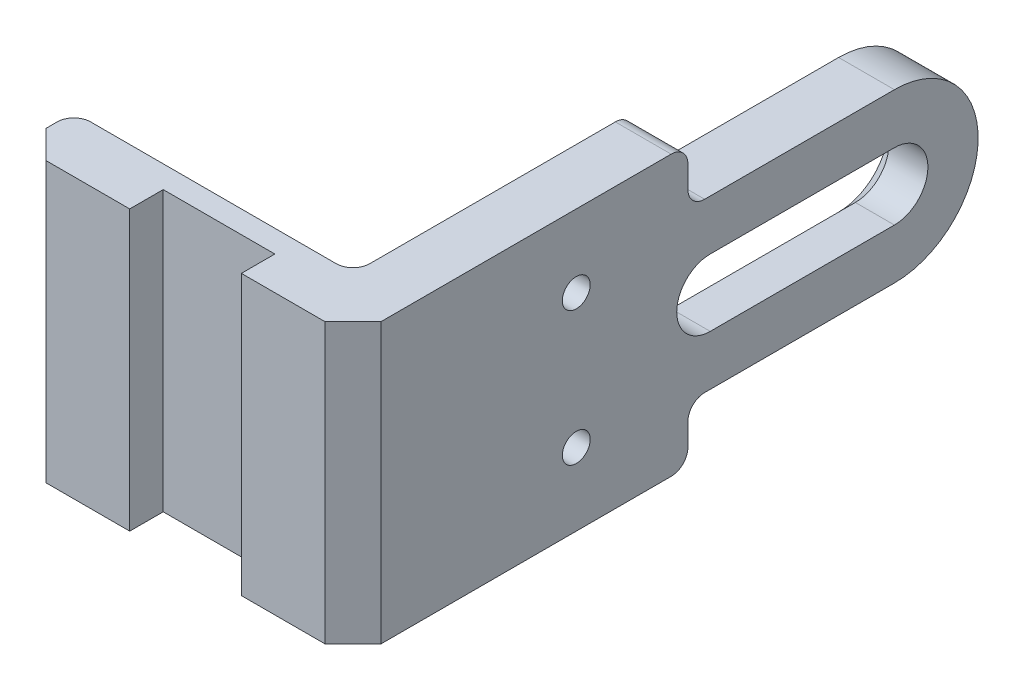
ISO-10303-21;
HEADER;
FILE_DESCRIPTION(('STEP AP214'),'2;1');
FILE_NAME('part.step','',(''),(''),'','','');
FILE_SCHEMA(('AUTOMOTIVE_DESIGN { 1 0 10303 214 1 1 1 1 }'));
ENDSEC;
DATA;
#1=APPLICATION_CONTEXT('core data for automotive mechanical design processes');
#2=APPLICATION_PROTOCOL_DEFINITION('international standard','automotive_design',2000,#1);
#3=PRODUCT_CONTEXT('',#1,'mechanical');
#4=PRODUCT('Part','Part','',(#3));
#5=PRODUCT_RELATED_PRODUCT_CATEGORY('part','',(#4));
#6=PRODUCT_DEFINITION_FORMATION('','',#4);
#7=PRODUCT_DEFINITION_CONTEXT('part definition',#1,'design');
#8=PRODUCT_DEFINITION('design','',#6,#7);
#9=PRODUCT_DEFINITION_SHAPE('','',#8);
#10=(LENGTH_UNIT() NAMED_UNIT(*) SI_UNIT(.MILLI.,.METRE.));
#11=(NAMED_UNIT(*) PLANE_ANGLE_UNIT() SI_UNIT($,.RADIAN.));
#12=(NAMED_UNIT(*) SI_UNIT($,.STERADIAN.) SOLID_ANGLE_UNIT());
#13=UNCERTAINTY_MEASURE_WITH_UNIT(LENGTH_MEASURE(1.E-05),#10,'distance_accuracy_value','');
#14=(GEOMETRIC_REPRESENTATION_CONTEXT(3) GLOBAL_UNCERTAINTY_ASSIGNED_CONTEXT((#13)) GLOBAL_UNIT_ASSIGNED_CONTEXT((#10,
#11,#12)) REPRESENTATION_CONTEXT('',''));
#15=CARTESIAN_POINT('',(0.,0.,0.));
#16=DIRECTION('',(0.,0.,1.));
#17=DIRECTION('',(1.,0.,0.));
#18=AXIS2_PLACEMENT_3D('',#15,#16,#17);
#19=CARTESIAN_POINT('',(0.,25.,0.));
#20=DIRECTION('',(0.,0.,1.));
#21=DIRECTION('',(1.,0.,0.));
#22=AXIS2_PLACEMENT_3D('',#19,#20,#21);
#23=PLANE('',#22);
#24=DIRECTION('',(-1.,0.,0.));
#25=VECTOR('',#24,1.);
#26=CARTESIAN_POINT('',(0.,0.,0.));
#27=LINE('',#26,#25);
#28=CARTESIAN_POINT('',(-2.50000000000002,0.,0.));
#29=VERTEX_POINT('',#28);
#30=CARTESIAN_POINT('',(-10.,0.,0.));
#31=VERTEX_POINT('',#30);
#32=EDGE_CURVE('E249',#29,#31,#27,.T.);
#33=ORIENTED_EDGE('',*,*,#32,.F.);
#34=DIRECTION('',(0.,1.,0.));
#35=VECTOR('',#34,1.);
#36=CARTESIAN_POINT('',(-2.50000000000002,25.,0.));
#37=LINE('',#36,#35);
#38=CARTESIAN_POINT('',(-2.50000000000002,25.,0.));
#39=VERTEX_POINT('',#38);
#40=EDGE_CURVE('E409',#29,#39,#37,.T.);
#41=ORIENTED_EDGE('',*,*,#40,.T.);
#42=DIRECTION('',(-1.,0.,0.));
#43=VECTOR('',#42,1.);
#44=CARTESIAN_POINT('',(0.,25.,0.));
#45=LINE('',#44,#43);
#46=CARTESIAN_POINT('',(-10.,25.,0.));
#47=VERTEX_POINT('',#46);
#48=EDGE_CURVE('E332',#39,#47,#45,.T.);
#49=ORIENTED_EDGE('',*,*,#48,.T.);
#50=DIRECTION('',(0.,1.,0.));
#51=VECTOR('',#50,1.);
#52=CARTESIAN_POINT('',(-10.,0.,0.));
#53=LINE('',#52,#51);
#54=EDGE_CURVE('E244',#31,#47,#53,.T.);
#55=ORIENTED_EDGE('',*,*,#54,.F.);
#56=EDGE_LOOP('',(#33,#41,#49,#55));
#57=FACE_BOUND('',#56,.T.);
#58=ADVANCED_FACE('F37',(#57),#23,.T.);
#59=CARTESIAN_POINT('',(0.,25.,0.));
#60=DIRECTION('',(0.,-1.,0.));
#61=DIRECTION('',(0.,0.,-1.));
#62=AXIS2_PLACEMENT_3D('',#59,#60,#61);
#63=PLANE('',#62);
#64=DIRECTION('',(-1.,0.,0.));
#65=VECTOR('',#64,1.);
#66=CARTESIAN_POINT('',(-5.,25.,-5.));
#67=LINE('',#66,#65);
#68=CARTESIAN_POINT('',(-6.5,25.,-5.));
#69=VERTEX_POINT('',#68);
#70=CARTESIAN_POINT('',(-28.5,25.,-5.));
#71=VERTEX_POINT('',#70);
#72=EDGE_CURVE('E338',#69,#71,#67,.T.);
#73=ORIENTED_EDGE('',*,*,#72,.T.);
#74=CARTESIAN_POINT('',(-28.5,25.,-3.5));
#75=DIRECTION('',(0.,-1.,0.));
#76=DIRECTION('',(0.,0.,-1.));
#77=AXIS2_PLACEMENT_3D('',#74,#75,#76);
#78=CIRCLE('',#77,1.5);
#79=CARTESIAN_POINT('',(-30.,25.,-3.5));
#80=VERTEX_POINT('',#79);
#81=EDGE_CURVE('E430',#71,#80,#78,.F.);
#82=ORIENTED_EDGE('',*,*,#81,.T.);
#83=DIRECTION('',(0.,0.,-1.));
#84=VECTOR('',#83,1.);
#85=CARTESIAN_POINT('',(-30.,25.,0.));
#86=LINE('',#85,#84);
#87=CARTESIAN_POINT('',(-30.,25.,-2.50000000000001));
#88=VERTEX_POINT('',#87);
#89=EDGE_CURVE('E334',#88,#80,#86,.T.);
#90=ORIENTED_EDGE('',*,*,#89,.F.);
#91=DIRECTION('',(-0.707106781186546,0.,-0.707106781186549));
#92=VECTOR('',#91,1.);
#93=CARTESIAN_POINT('',(-27.5,25.,0.));
#94=LINE('',#93,#92);
#95=CARTESIAN_POINT('',(-27.5,25.,0.));
#96=VERTEX_POINT('',#95);
#97=EDGE_CURVE('E411',#88,#96,#94,.F.);
#98=ORIENTED_EDGE('',*,*,#97,.T.);
#99=CARTESIAN_POINT('',(-20.,25.,0.));
#100=VERTEX_POINT('',#99);
#101=EDGE_CURVE('E335',#100,#96,#45,.T.);
#102=ORIENTED_EDGE('',*,*,#101,.F.);
#103=DIRECTION('',(0.,0.,1.));
#104=VECTOR('',#103,1.);
#105=CARTESIAN_POINT('',(-20.,25.,-3.));
#106=LINE('',#105,#104);
#107=CARTESIAN_POINT('',(-20.,25.,-3.));
#108=VERTEX_POINT('',#107);
#109=EDGE_CURVE('E234',#108,#100,#106,.T.);
#110=ORIENTED_EDGE('',*,*,#109,.F.);
#111=DIRECTION('',(1.,0.,0.));
#112=VECTOR('',#111,1.);
#113=CARTESIAN_POINT('',(-20.,25.,-3.));
#114=LINE('',#113,#112);
#115=CARTESIAN_POINT('',(-10.,25.,-3.));
#116=VERTEX_POINT('',#115);
#117=EDGE_CURVE('E254',#108,#116,#114,.T.);
#118=ORIENTED_EDGE('',*,*,#117,.T.);
#119=DIRECTION('',(0.,0.,1.));
#120=VECTOR('',#119,1.);
#121=CARTESIAN_POINT('',(-10.,25.,-3.));
#122=LINE('',#121,#120);
#123=EDGE_CURVE('E242',#116,#47,#122,.T.);
#124=ORIENTED_EDGE('',*,*,#123,.T.);
#125=ORIENTED_EDGE('',*,*,#48,.F.);
#126=DIRECTION('',(0.707106781186549,0.,-0.707106781186546));
#127=VECTOR('',#126,1.);
#128=CARTESIAN_POINT('',(0.,25.,-2.50000000000001));
#129=LINE('',#128,#127);
#130=CARTESIAN_POINT('',(0.,25.,-2.50000000000001));
#131=VERTEX_POINT('',#130);
#132=EDGE_CURVE('E413',#39,#131,#129,.T.);
#133=ORIENTED_EDGE('',*,*,#132,.T.);
#134=DIRECTION('',(0.,0.,-1.));
#135=VECTOR('',#134,1.);
#136=CARTESIAN_POINT('',(0.,25.,0.));
#137=LINE('',#136,#135);
#138=CARTESIAN_POINT('',(0.,25.,-28.5));
#139=VERTEX_POINT('',#138);
#140=EDGE_CURVE('E343',#131,#139,#137,.T.);
#141=ORIENTED_EDGE('',*,*,#140,.T.);
#142=DIRECTION('',(-1.,0.,0.));
#143=VECTOR('',#142,1.);
#144=CARTESIAN_POINT('',(0.,25.,-28.5));
#145=LINE('',#144,#143);
#146=CARTESIAN_POINT('',(-5.,25.,-28.5));
#147=VERTEX_POINT('',#146);
#148=EDGE_CURVE('E391',#139,#147,#145,.T.);
#149=ORIENTED_EDGE('',*,*,#148,.T.);
#150=DIRECTION('',(0.,0.,-1.));
#151=VECTOR('',#150,1.);
#152=CARTESIAN_POINT('',(-5.,25.,-5.));
#153=LINE('',#152,#151);
#154=CARTESIAN_POINT('',(-5.,25.,-6.5));
#155=VERTEX_POINT('',#154);
#156=EDGE_CURVE('E341',#155,#147,#153,.T.);
#157=ORIENTED_EDGE('',*,*,#156,.F.);
#158=CARTESIAN_POINT('',(-6.5,25.,-6.5));
#159=DIRECTION('',(0.,-1.,0.));
#160=DIRECTION('',(0.,0.,-1.));
#161=AXIS2_PLACEMENT_3D('',#158,#159,#160);
#162=CIRCLE('',#161,1.5);
#163=EDGE_CURVE('E436',#155,#69,#162,.T.);
#164=ORIENTED_EDGE('',*,*,#163,.T.);
#165=EDGE_LOOP('',(#73,#82,#90,#98,#102,#110,#118,#124,#125,#133,#141,#149,#157,#164));
#166=FACE_BOUND('',#165,.T.);
#167=ADVANCED_FACE('F504',(#166),#63,.F.);
#168=CARTESIAN_POINT('',(0.,0.,0.));
#169=DIRECTION('',(0.,-1.,0.));
#170=DIRECTION('',(0.,0.,-1.));
#171=AXIS2_PLACEMENT_3D('',#168,#169,#170);
#172=PLANE('',#171);
#173=DIRECTION('',(0.,0.,-1.));
#174=VECTOR('',#173,1.);
#175=CARTESIAN_POINT('',(-30.,0.,0.));
#176=LINE('',#175,#174);
#177=CARTESIAN_POINT('',(-30.,0.,-2.50000000000001));
#178=VERTEX_POINT('',#177);
#179=CARTESIAN_POINT('',(-30.,0.,-3.5));
#180=VERTEX_POINT('',#179);
#181=EDGE_CURVE('E347',#178,#180,#176,.T.);
#182=ORIENTED_EDGE('',*,*,#181,.T.);
#183=CARTESIAN_POINT('',(-28.5,0.,-3.5));
#184=DIRECTION('',(0.,-1.,0.));
#185=DIRECTION('',(0.,0.,-1.));
#186=AXIS2_PLACEMENT_3D('',#183,#184,#185);
#187=CIRCLE('',#186,1.5);
#188=CARTESIAN_POINT('',(-28.5,0.,-5.));
#189=VERTEX_POINT('',#188);
#190=EDGE_CURVE('E423',#180,#189,#187,.T.);
#191=ORIENTED_EDGE('',*,*,#190,.T.);
#192=DIRECTION('',(-1.,0.,0.));
#193=VECTOR('',#192,1.);
#194=CARTESIAN_POINT('',(-5.,0.,-5.));
#195=LINE('',#194,#193);
#196=CARTESIAN_POINT('',(-6.5,0.,-5.));
#197=VERTEX_POINT('',#196);
#198=EDGE_CURVE('E349',#197,#189,#195,.T.);
#199=ORIENTED_EDGE('',*,*,#198,.F.);
#200=CARTESIAN_POINT('',(-6.5,0.,-6.5));
#201=DIRECTION('',(0.,-1.,0.));
#202=DIRECTION('',(0.,0.,-1.));
#203=AXIS2_PLACEMENT_3D('',#200,#201,#202);
#204=CIRCLE('',#203,1.5);
#205=CARTESIAN_POINT('',(-5.,0.,-6.5));
#206=VERTEX_POINT('',#205);
#207=EDGE_CURVE('E434',#197,#206,#204,.F.);
#208=ORIENTED_EDGE('',*,*,#207,.T.);
#209=DIRECTION('',(0.,0.,-1.));
#210=VECTOR('',#209,1.);
#211=CARTESIAN_POINT('',(-5.,0.,-5.));
#212=LINE('',#211,#210);
#213=CARTESIAN_POINT('',(-5.,0.,-28.5));
#214=VERTEX_POINT('',#213);
#215=EDGE_CURVE('E352',#206,#214,#212,.T.);
#216=ORIENTED_EDGE('',*,*,#215,.T.);
#217=DIRECTION('',(-1.,0.,0.));
#218=VECTOR('',#217,1.);
#219=CARTESIAN_POINT('',(0.,0.,-28.5));
#220=LINE('',#219,#218);
#221=CARTESIAN_POINT('',(0.,0.,-28.5));
#222=VERTEX_POINT('',#221);
#223=EDGE_CURVE('E383',#214,#222,#220,.F.);
#224=ORIENTED_EDGE('',*,*,#223,.T.);
#225=DIRECTION('',(0.,0.,-1.));
#226=VECTOR('',#225,1.);
#227=CARTESIAN_POINT('',(0.,0.,0.));
#228=LINE('',#227,#226);
#229=CARTESIAN_POINT('',(0.,0.,-2.50000000000001));
#230=VERTEX_POINT('',#229);
#231=EDGE_CURVE('E354',#230,#222,#228,.T.);
#232=ORIENTED_EDGE('',*,*,#231,.F.);
#233=DIRECTION('',(-0.707106781186549,0.,0.707106781186546));
#234=VECTOR('',#233,1.);
#235=CARTESIAN_POINT('',(-1.25,0.,-1.25000000000001));
#236=LINE('',#235,#234);
#237=EDGE_CURVE('E407',#230,#29,#236,.T.);
#238=ORIENTED_EDGE('',*,*,#237,.T.);
#239=ORIENTED_EDGE('',*,*,#32,.T.);
#240=DIRECTION('',(0.,0.,1.));
#241=VECTOR('',#240,1.);
#242=CARTESIAN_POINT('',(-10.,0.,-3.));
#243=LINE('',#242,#241);
#244=CARTESIAN_POINT('',(-10.,0.,-3.));
#245=VERTEX_POINT('',#244);
#246=EDGE_CURVE('E233',#245,#31,#243,.T.);
#247=ORIENTED_EDGE('',*,*,#246,.F.);
#248=DIRECTION('',(1.,0.,0.));
#249=VECTOR('',#248,1.);
#250=CARTESIAN_POINT('',(-20.,0.,-3.));
#251=LINE('',#250,#249);
#252=CARTESIAN_POINT('',(-20.,0.,-3.));
#253=VERTEX_POINT('',#252);
#254=EDGE_CURVE('E222',#253,#245,#251,.T.);
#255=ORIENTED_EDGE('',*,*,#254,.F.);
#256=DIRECTION('',(0.,0.,1.));
#257=VECTOR('',#256,1.);
#258=CARTESIAN_POINT('',(-20.,0.,-3.));
#259=LINE('',#258,#257);
#260=CARTESIAN_POINT('',(-20.,0.,0.));
#261=VERTEX_POINT('',#260);
#262=EDGE_CURVE('E250',#253,#261,#259,.T.);
#263=ORIENTED_EDGE('',*,*,#262,.T.);
#264=CARTESIAN_POINT('',(-27.5,0.,0.));
#265=VERTEX_POINT('',#264);
#266=EDGE_CURVE('E331',#261,#265,#27,.T.);
#267=ORIENTED_EDGE('',*,*,#266,.T.);
#268=DIRECTION('',(0.707106781186546,0.,0.707106781186549));
#269=VECTOR('',#268,1.);
#270=CARTESIAN_POINT('',(-13.7500000000001,0.,13.75));
#271=LINE('',#270,#269);
#272=EDGE_CURVE('E405',#265,#178,#271,.F.);
#273=ORIENTED_EDGE('',*,*,#272,.T.);
#274=EDGE_LOOP('',(#182,#191,#199,#208,#216,#224,#232,#238,#239,#247,#255,#263,#267,#273));
#275=FACE_BOUND('',#274,.T.);
#276=ADVANCED_FACE('F247',(#275),#172,.T.);
#277=CARTESIAN_POINT('',(0.,25.,0.));
#278=DIRECTION('',(-1.,0.,0.));
#279=DIRECTION('',(0.,0.,1.));
#280=AXIS2_PLACEMENT_3D('',#277,#278,#279);
#281=PLANE('',#280);
#282=CARTESIAN_POINT('',(0.,18.5,-20.));
#283=DIRECTION('',(1.,0.,0.));
#284=DIRECTION('',(0.,0.,-1.));
#285=AXIS2_PLACEMENT_3D('',#282,#283,#284);
#286=CIRCLE('',#285,1.25);
#287=CARTESIAN_POINT('',(0.,18.5,-21.25));
#288=VERTEX_POINT('',#287);
#289=EDGE_CURVE('E281',#288,#288,#286,.T.);
#290=ORIENTED_EDGE('',*,*,#289,.F.);
#291=EDGE_LOOP('',(#290));
#292=FACE_BOUND('',#291,.T.);
#293=CARTESIAN_POINT('',(0.,6.5,-20.));
#294=DIRECTION('',(1.,0.,0.));
#295=DIRECTION('',(0.,0.,-1.));
#296=AXIS2_PLACEMENT_3D('',#293,#294,#295);
#297=CIRCLE('',#296,1.25);
#298=CARTESIAN_POINT('',(0.,6.5,-21.25));
#299=VERTEX_POINT('',#298);
#300=EDGE_CURVE('E271',#299,#299,#297,.T.);
#301=ORIENTED_EDGE('',*,*,#300,.F.);
#302=EDGE_LOOP('',(#301));
#303=FACE_BOUND('',#302,.T.);
#304=DIRECTION('',(0.,0.,-1.));
#305=VECTOR('',#304,1.);
#306=CARTESIAN_POINT('',(0.,9.5,-32.));
#307=LINE('',#306,#305);
#308=CARTESIAN_POINT('',(0.,9.5,-32.));
#309=VERTEX_POINT('',#308);
#310=CARTESIAN_POINT('',(0.,9.5,-48.5));
#311=VERTEX_POINT('',#310);
#312=EDGE_CURVE('E289',#309,#311,#307,.T.);
#313=ORIENTED_EDGE('',*,*,#312,.F.);
#314=CARTESIAN_POINT('',(0.,12.5,-32.));
#315=DIRECTION('',(1.,0.,0.));
#316=DIRECTION('',(0.,0.,-1.));
#317=AXIS2_PLACEMENT_3D('',#314,#315,#316);
#318=CIRCLE('',#317,3.);
#319=CARTESIAN_POINT('',(0.,15.5,-32.));
#320=VERTEX_POINT('',#319);
#321=EDGE_CURVE('E284',#320,#309,#318,.T.);
#322=ORIENTED_EDGE('',*,*,#321,.F.);
#323=DIRECTION('',(0.,0.,-1.));
#324=VECTOR('',#323,1.);
#325=CARTESIAN_POINT('',(0.,15.5,-32.));
#326=LINE('',#325,#324);
#327=CARTESIAN_POINT('',(0.,15.5,-48.5));
#328=VERTEX_POINT('',#327);
#329=EDGE_CURVE('E295',#320,#328,#326,.T.);
#330=ORIENTED_EDGE('',*,*,#329,.T.);
#331=CARTESIAN_POINT('',(0.,12.5,-48.5));
#332=DIRECTION('',(1.,0.,0.));
#333=DIRECTION('',(0.,0.,-1.));
#334=AXIS2_PLACEMENT_3D('',#331,#332,#333);
#335=CIRCLE('',#334,3.);
#336=EDGE_CURVE('E292',#311,#328,#335,.T.);
#337=ORIENTED_EDGE('',*,*,#336,.F.);
#338=EDGE_LOOP('',(#313,#322,#330,#337));
#339=FACE_BOUND('',#338,.T.);
#340=ORIENTED_EDGE('',*,*,#140,.F.);
#341=DIRECTION('',(0.,-1.,0.));
#342=VECTOR('',#341,1.);
#343=CARTESIAN_POINT('',(0.,0.,-2.50000000000001));
#344=LINE('',#343,#342);
#345=EDGE_CURVE('E402',#131,#230,#344,.T.);
#346=ORIENTED_EDGE('',*,*,#345,.T.);
#347=ORIENTED_EDGE('',*,*,#231,.T.);
#348=CARTESIAN_POINT('',(0.,1.5,-28.5));
#349=DIRECTION('',(-1.,0.,0.));
#350=DIRECTION('',(0.,0.,1.));
#351=AXIS2_PLACEMENT_3D('',#348,#349,#350);
#352=CIRCLE('',#351,1.5);
#353=CARTESIAN_POINT('',(0.,1.5,-30.));
#354=VERTEX_POINT('',#353);
#355=EDGE_CURVE('E389',#222,#354,#352,.F.);
#356=ORIENTED_EDGE('',*,*,#355,.T.);
#357=DIRECTION('',(0.,-1.,0.));
#358=VECTOR('',#357,1.);
#359=CARTESIAN_POINT('',(0.,0.,-30.));
#360=LINE('',#359,#358);
#361=CARTESIAN_POINT('',(0.,3.5,-30.));
#362=VERTEX_POINT('',#361);
#363=EDGE_CURVE('E308',#362,#354,#360,.T.);
#364=ORIENTED_EDGE('',*,*,#363,.F.);
#365=CARTESIAN_POINT('',(0.,3.5,-31.5));
#366=DIRECTION('',(-1.,0.,0.));
#367=DIRECTION('',(0.,0.,1.));
#368=AXIS2_PLACEMENT_3D('',#365,#366,#367);
#369=CIRCLE('',#368,1.5);
#370=CARTESIAN_POINT('',(0.,5.,-31.5));
#371=VERTEX_POINT('',#370);
#372=EDGE_CURVE('E398',#362,#371,#369,.T.);
#373=ORIENTED_EDGE('',*,*,#372,.T.);
#374=DIRECTION('',(0.,0.,-1.));
#375=VECTOR('',#374,1.);
#376=CARTESIAN_POINT('',(0.,5.,0.));
#377=LINE('',#376,#375);
#378=CARTESIAN_POINT('',(0.,5.,-48.5));
#379=VERTEX_POINT('',#378);
#380=EDGE_CURVE('E301',#371,#379,#377,.T.);
#381=ORIENTED_EDGE('',*,*,#380,.T.);
#382=CARTESIAN_POINT('',(0.,12.5,-48.5));
#383=DIRECTION('',(1.,0.,0.));
#384=DIRECTION('',(0.,0.,-1.));
#385=AXIS2_PLACEMENT_3D('',#382,#383,#384);
#386=CIRCLE('',#385,7.5);
#387=CARTESIAN_POINT('',(0.,20.,-48.5));
#388=VERTEX_POINT('',#387);
#389=EDGE_CURVE('E322',#379,#388,#386,.T.);
#390=ORIENTED_EDGE('',*,*,#389,.T.);
#391=DIRECTION('',(0.,0.,-1.));
#392=VECTOR('',#391,1.);
#393=CARTESIAN_POINT('',(0.,20.,0.));
#394=LINE('',#393,#392);
#395=CARTESIAN_POINT('',(0.,20.,-31.5));
#396=VERTEX_POINT('',#395);
#397=EDGE_CURVE('E320',#396,#388,#394,.T.);
#398=ORIENTED_EDGE('',*,*,#397,.F.);
#399=CARTESIAN_POINT('',(0.,21.5,-31.5));
#400=DIRECTION('',(-1.,0.,0.));
#401=DIRECTION('',(0.,0.,1.));
#402=AXIS2_PLACEMENT_3D('',#399,#400,#401);
#403=CIRCLE('',#402,1.5);
#404=CARTESIAN_POINT('',(0.,21.5,-30.));
#405=VERTEX_POINT('',#404);
#406=EDGE_CURVE('E394',#396,#405,#403,.T.);
#407=ORIENTED_EDGE('',*,*,#406,.T.);
#408=DIRECTION('',(0.,-1.,0.));
#409=VECTOR('',#408,1.);
#410=CARTESIAN_POINT('',(0.,0.,-30.));
#411=LINE('',#410,#409);
#412=CARTESIAN_POINT('',(0.,23.5,-30.));
#413=VERTEX_POINT('',#412);
#414=EDGE_CURVE('E317',#413,#405,#411,.T.);
#415=ORIENTED_EDGE('',*,*,#414,.F.);
#416=CARTESIAN_POINT('',(0.,23.5,-28.5));
#417=DIRECTION('',(-1.,0.,0.));
#418=DIRECTION('',(0.,0.,1.));
#419=AXIS2_PLACEMENT_3D('',#416,#417,#418);
#420=CIRCLE('',#419,1.5);
#421=EDGE_CURVE('E386',#413,#139,#420,.F.);
#422=ORIENTED_EDGE('',*,*,#421,.T.);
#423=EDGE_LOOP('',(#340,#346,#347,#356,#364,#373,#381,#390,#398,#407,#415,#422));
#424=FACE_BOUND('',#423,.T.);
#425=ADVANCED_FACE('F488',(#292,#303,#339,#424),#281,.F.);
#426=CARTESIAN_POINT('',(-5.,25.,-5.));
#427=DIRECTION('',(-1.,0.,0.));
#428=DIRECTION('',(0.,0.,1.));
#429=AXIS2_PLACEMENT_3D('',#426,#427,#428);
#430=PLANE('',#429);
#431=CARTESIAN_POINT('',(-5.,12.5,-32.));
#432=DIRECTION('',(-1.,0.,0.));
#433=DIRECTION('',(0.,0.,1.));
#434=AXIS2_PLACEMENT_3D('',#431,#432,#433);
#435=CIRCLE('',#434,4.5);
#436=CARTESIAN_POINT('',(-5.,17.,-32.));
#437=VERTEX_POINT('',#436);
#438=CARTESIAN_POINT('',(-5.,8.,-32.));
#439=VERTEX_POINT('',#438);
#440=EDGE_CURVE('E443',#437,#439,#435,.F.);
#441=ORIENTED_EDGE('',*,*,#440,.T.);
#442=DIRECTION('',(0.,0.,-1.));
#443=VECTOR('',#442,1.);
#444=CARTESIAN_POINT('',(-5.,8.,-48.5));
#445=LINE('',#444,#443);
#446=CARTESIAN_POINT('',(-5.,8.,-48.5));
#447=VERTEX_POINT('',#446);
#448=EDGE_CURVE('E447',#439,#447,#445,.T.);
#449=ORIENTED_EDGE('',*,*,#448,.T.);
#450=CARTESIAN_POINT('',(-5.,12.5,-48.5));
#451=DIRECTION('',(-1.,0.,0.));
#452=DIRECTION('',(0.,0.,1.));
#453=AXIS2_PLACEMENT_3D('',#450,#451,#452);
#454=CIRCLE('',#453,4.5);
#455=CARTESIAN_POINT('',(-5.,17.,-48.5));
#456=VERTEX_POINT('',#455);
#457=EDGE_CURVE('E445',#447,#456,#454,.F.);
#458=ORIENTED_EDGE('',*,*,#457,.T.);
#459=DIRECTION('',(0.,0.,1.));
#460=VECTOR('',#459,1.);
#461=CARTESIAN_POINT('',(-5.,17.,-5.));
#462=LINE('',#461,#460);
#463=EDGE_CURVE('E441',#456,#437,#462,.T.);
#464=ORIENTED_EDGE('',*,*,#463,.T.);
#465=EDGE_LOOP('',(#441,#449,#458,#464));
#466=FACE_BOUND('',#465,.T.);
#467=CARTESIAN_POINT('',(-5.,18.5,-20.));
#468=DIRECTION('',(1.,0.,0.));
#469=DIRECTION('',(0.,0.,-1.));
#470=AXIS2_PLACEMENT_3D('',#467,#468,#469);
#471=CIRCLE('',#470,3.);
#472=CARTESIAN_POINT('',(-5.,18.5,-23.));
#473=VERTEX_POINT('',#472);
#474=EDGE_CURVE('E268',#473,#473,#471,.T.);
#475=ORIENTED_EDGE('',*,*,#474,.T.);
#476=EDGE_LOOP('',(#475));
#477=FACE_BOUND('',#476,.T.);
#478=CARTESIAN_POINT('',(-5.,6.5,-20.));
#479=DIRECTION('',(1.,0.,0.));
#480=DIRECTION('',(0.,0.,-1.));
#481=AXIS2_PLACEMENT_3D('',#478,#479,#480);
#482=CIRCLE('',#481,3.);
#483=CARTESIAN_POINT('',(-5.,6.5,-23.));
#484=VERTEX_POINT('',#483);
#485=EDGE_CURVE('E267',#484,#484,#482,.T.);
#486=ORIENTED_EDGE('',*,*,#485,.T.);
#487=EDGE_LOOP('',(#486));
#488=FACE_BOUND('',#487,.T.);
#489=ORIENTED_EDGE('',*,*,#215,.F.);
#490=DIRECTION('',(0.,-1.,0.));
#491=VECTOR('',#490,1.);
#492=CARTESIAN_POINT('',(-5.,25.,-6.5));
#493=LINE('',#492,#491);
#494=EDGE_CURVE('E432',#206,#155,#493,.F.);
#495=ORIENTED_EDGE('',*,*,#494,.T.);
#496=ORIENTED_EDGE('',*,*,#156,.T.);
#497=CARTESIAN_POINT('',(-5.,23.5,-28.5));
#498=DIRECTION('',(-1.,0.,0.));
#499=DIRECTION('',(0.,0.,1.));
#500=AXIS2_PLACEMENT_3D('',#497,#498,#499);
#501=CIRCLE('',#500,1.5);
#502=CARTESIAN_POINT('',(-5.,23.5,-30.));
#503=VERTEX_POINT('',#502);
#504=EDGE_CURVE('E378',#147,#503,#501,.T.);
#505=ORIENTED_EDGE('',*,*,#504,.T.);
#506=DIRECTION('',(0.,1.,0.));
#507=VECTOR('',#506,1.);
#508=CARTESIAN_POINT('',(-5.,25.,-30.));
#509=LINE('',#508,#507);
#510=CARTESIAN_POINT('',(-5.,21.5,-30.));
#511=VERTEX_POINT('',#510);
#512=EDGE_CURVE('E328',#511,#503,#509,.T.);
#513=ORIENTED_EDGE('',*,*,#512,.F.);
#514=CARTESIAN_POINT('',(-5.,21.5,-31.5));
#515=DIRECTION('',(-1.,0.,0.));
#516=DIRECTION('',(0.,0.,1.));
#517=AXIS2_PLACEMENT_3D('',#514,#515,#516);
#518=CIRCLE('',#517,1.5);
#519=CARTESIAN_POINT('',(-5.,20.,-31.5));
#520=VERTEX_POINT('',#519);
#521=EDGE_CURVE('E396',#511,#520,#518,.F.);
#522=ORIENTED_EDGE('',*,*,#521,.T.);
#523=DIRECTION('',(0.,0.,1.));
#524=VECTOR('',#523,1.);
#525=CARTESIAN_POINT('',(-5.,20.,-5.));
#526=LINE('',#525,#524);
#527=CARTESIAN_POINT('',(-5.,20.,-48.5));
#528=VERTEX_POINT('',#527);
#529=EDGE_CURVE('E345',#528,#520,#526,.T.);
#530=ORIENTED_EDGE('',*,*,#529,.F.);
#531=CARTESIAN_POINT('',(-5.,12.5,-48.5));
#532=DIRECTION('',(-1.,0.,0.));
#533=DIRECTION('',(0.,0.,1.));
#534=AXIS2_PLACEMENT_3D('',#531,#532,#533);
#535=CIRCLE('',#534,7.5);
#536=CARTESIAN_POINT('',(-5.,5.,-48.5));
#537=VERTEX_POINT('',#536);
#538=EDGE_CURVE('E358',#528,#537,#535,.T.);
#539=ORIENTED_EDGE('',*,*,#538,.T.);
#540=DIRECTION('',(0.,0.,1.));
#541=VECTOR('',#540,1.);
#542=CARTESIAN_POINT('',(-5.,5.,-5.));
#543=LINE('',#542,#541);
#544=CARTESIAN_POINT('',(-5.,5.,-31.5));
#545=VERTEX_POINT('',#544);
#546=EDGE_CURVE('E360',#537,#545,#543,.T.);
#547=ORIENTED_EDGE('',*,*,#546,.T.);
#548=CARTESIAN_POINT('',(-5.,3.5,-31.5));
#549=DIRECTION('',(-1.,0.,0.));
#550=DIRECTION('',(0.,0.,1.));
#551=AXIS2_PLACEMENT_3D('',#548,#549,#550);
#552=CIRCLE('',#551,1.5);
#553=CARTESIAN_POINT('',(-5.,3.5,-30.));
#554=VERTEX_POINT('',#553);
#555=EDGE_CURVE('E400',#545,#554,#552,.F.);
#556=ORIENTED_EDGE('',*,*,#555,.T.);
#557=DIRECTION('',(0.,1.,0.));
#558=VECTOR('',#557,1.);
#559=CARTESIAN_POINT('',(-5.,25.,-30.));
#560=LINE('',#559,#558);
#561=CARTESIAN_POINT('',(-5.,1.5,-30.));
#562=VERTEX_POINT('',#561);
#563=EDGE_CURVE('E314',#562,#554,#560,.T.);
#564=ORIENTED_EDGE('',*,*,#563,.F.);
#565=CARTESIAN_POINT('',(-5.,1.5,-28.5));
#566=DIRECTION('',(-1.,0.,0.));
#567=DIRECTION('',(0.,0.,1.));
#568=AXIS2_PLACEMENT_3D('',#565,#566,#567);
#569=CIRCLE('',#568,1.5);
#570=EDGE_CURVE('E380',#562,#214,#569,.T.);
#571=ORIENTED_EDGE('',*,*,#570,.T.);
#572=EDGE_LOOP('',(#489,#495,#496,#505,#513,#522,#530,#539,#547,#556,#564,#571));
#573=FACE_BOUND('',#572,.T.);
#574=ADVANCED_FACE('F471',(#466,#477,#488,#573),#430,.T.);
#575=ORIENTED_EDGE('',*,*,#101,.T.);
#576=DIRECTION('',(0.,-1.,0.));
#577=VECTOR('',#576,1.);
#578=CARTESIAN_POINT('',(-27.5,25.,0.));
#579=LINE('',#578,#577);
#580=EDGE_CURVE('E415',#96,#265,#579,.T.);
#581=ORIENTED_EDGE('',*,*,#580,.T.);
#582=ORIENTED_EDGE('',*,*,#266,.F.);
#583=DIRECTION('',(0.,1.,0.));
#584=VECTOR('',#583,1.);
#585=CARTESIAN_POINT('',(-20.,0.,0.));
#586=LINE('',#585,#584);
#587=EDGE_CURVE('E259',#261,#100,#586,.T.);
#588=ORIENTED_EDGE('',*,*,#587,.T.);
#589=EDGE_LOOP('',(#575,#581,#582,#588));
#590=FACE_BOUND('',#589,.T.);
#591=ADVANCED_FACE('F507',(#590),#23,.T.);
#592=CARTESIAN_POINT('',(-5.,25.,-5.));
#593=DIRECTION('',(0.,0.,1.));
#594=DIRECTION('',(1.,0.,0.));
#595=AXIS2_PLACEMENT_3D('',#592,#593,#594);
#596=PLANE('',#595);
#597=ORIENTED_EDGE('',*,*,#198,.T.);
#598=DIRECTION('',(0.,-1.,0.));
#599=VECTOR('',#598,1.);
#600=CARTESIAN_POINT('',(-28.5,25.,-5.));
#601=LINE('',#600,#599);
#602=EDGE_CURVE('E428',#189,#71,#601,.F.);
#603=ORIENTED_EDGE('',*,*,#602,.T.);
#604=ORIENTED_EDGE('',*,*,#72,.F.);
#605=DIRECTION('',(0.,-1.,0.));
#606=VECTOR('',#605,1.);
#607=CARTESIAN_POINT('',(-6.5,25.,-5.));
#608=LINE('',#607,#606);
#609=EDGE_CURVE('E425',#69,#197,#608,.T.);
#610=ORIENTED_EDGE('',*,*,#609,.T.);
#611=EDGE_LOOP('',(#597,#603,#604,#610));
#612=FACE_BOUND('',#611,.T.);
#613=ADVANCED_FACE('F516',(#612),#596,.F.);
#614=CARTESIAN_POINT('',(-30.,25.,0.));
#615=DIRECTION('',(-1.,0.,0.));
#616=DIRECTION('',(0.,0.,1.));
#617=AXIS2_PLACEMENT_3D('',#614,#615,#616);
#618=PLANE('',#617);
#619=ORIENTED_EDGE('',*,*,#89,.T.);
#620=DIRECTION('',(0.,-1.,0.));
#621=VECTOR('',#620,1.);
#622=CARTESIAN_POINT('',(-30.,0.,-3.5));
#623=LINE('',#622,#621);
#624=EDGE_CURVE('E420',#80,#180,#623,.T.);
#625=ORIENTED_EDGE('',*,*,#624,.T.);
#626=ORIENTED_EDGE('',*,*,#181,.F.);
#627=DIRECTION('',(0.,1.,0.));
#628=VECTOR('',#627,1.);
#629=CARTESIAN_POINT('',(-30.,25.,-2.50000000000001));
#630=LINE('',#629,#628);
#631=EDGE_CURVE('E418',#178,#88,#630,.T.);
#632=ORIENTED_EDGE('',*,*,#631,.T.);
#633=EDGE_LOOP('',(#619,#625,#626,#632));
#634=FACE_BOUND('',#633,.T.);
#635=ADVANCED_FACE('F522',(#634),#618,.T.);
#636=CARTESIAN_POINT('',(-25.,12.5,-48.5));
#637=DIRECTION('',(1.,0.,0.));
#638=DIRECTION('',(0.,0.,-1.));
#639=AXIS2_PLACEMENT_3D('',#636,#637,#638);
#640=CYLINDRICAL_SURFACE('',#639,7.5);
#641=DIRECTION('',(1.,0.,0.));
#642=VECTOR('',#641,1.);
#643=CARTESIAN_POINT('',(-25.,20.,-48.5));
#644=LINE('',#643,#642);
#645=EDGE_CURVE('E325',#528,#388,#644,.T.);
#646=ORIENTED_EDGE('',*,*,#645,.T.);
#647=ORIENTED_EDGE('',*,*,#389,.F.);
#648=DIRECTION('',(1.,0.,0.));
#649=VECTOR('',#648,1.);
#650=CARTESIAN_POINT('',(-25.,5.,-48.5));
#651=LINE('',#650,#649);
#652=EDGE_CURVE('E311',#537,#379,#651,.T.);
#653=ORIENTED_EDGE('',*,*,#652,.F.);
#654=ORIENTED_EDGE('',*,*,#538,.F.);
#655=EDGE_LOOP('',(#646,#647,#653,#654));
#656=FACE_BOUND('',#655,.T.);
#657=ADVANCED_FACE('F623',(#656),#640,.T.);
#658=CARTESIAN_POINT('',(-25.,20.,0.));
#659=DIRECTION('',(0.,-1.,0.));
#660=DIRECTION('',(0.,0.,-1.));
#661=AXIS2_PLACEMENT_3D('',#658,#659,#660);
#662=PLANE('',#661);
#663=ORIENTED_EDGE('',*,*,#529,.T.);
#664=DIRECTION('',(1.,0.,0.));
#665=VECTOR('',#664,1.);
#666=CARTESIAN_POINT('',(0.,20.,-31.5));
#667=LINE('',#666,#665);
#668=EDGE_CURVE('E363',#520,#396,#667,.T.);
#669=ORIENTED_EDGE('',*,*,#668,.T.);
#670=ORIENTED_EDGE('',*,*,#397,.T.);
#671=ORIENTED_EDGE('',*,*,#645,.F.);
#672=EDGE_LOOP('',(#663,#669,#670,#671));
#673=FACE_BOUND('',#672,.T.);
#674=ADVANCED_FACE('F627',(#673),#662,.F.);
#675=CARTESIAN_POINT('',(-25.,0.,-30.));
#676=DIRECTION('',(0.,0.,1.));
#677=DIRECTION('',(1.,0.,0.));
#678=AXIS2_PLACEMENT_3D('',#675,#676,#677);
#679=PLANE('',#678);
#680=ORIENTED_EDGE('',*,*,#414,.T.);
#681=DIRECTION('',(1.,0.,0.));
#682=VECTOR('',#681,1.);
#683=CARTESIAN_POINT('',(-5.,21.5,-30.));
#684=LINE('',#683,#682);
#685=EDGE_CURVE('E368',#405,#511,#684,.F.);
#686=ORIENTED_EDGE('',*,*,#685,.T.);
#687=ORIENTED_EDGE('',*,*,#512,.T.);
#688=DIRECTION('',(-1.,0.,0.));
#689=VECTOR('',#688,1.);
#690=CARTESIAN_POINT('',(-25.,23.5,-30.));
#691=LINE('',#690,#689);
#692=EDGE_CURVE('E366',#503,#413,#691,.F.);
#693=ORIENTED_EDGE('',*,*,#692,.T.);
#694=EDGE_LOOP('',(#680,#686,#687,#693));
#695=FACE_BOUND('',#694,.T.);
#696=ADVANCED_FACE('F633',(#695),#679,.F.);
#697=CARTESIAN_POINT('',(-25.,0.,-30.));
#698=DIRECTION('',(0.,0.,1.));
#699=DIRECTION('',(1.,0.,0.));
#700=AXIS2_PLACEMENT_3D('',#697,#698,#699);
#701=PLANE('',#700);
#702=ORIENTED_EDGE('',*,*,#563,.T.);
#703=DIRECTION('',(1.,0.,0.));
#704=VECTOR('',#703,1.);
#705=CARTESIAN_POINT('',(-25.,3.5,-30.));
#706=LINE('',#705,#704);
#707=EDGE_CURVE('E373',#554,#362,#706,.T.);
#708=ORIENTED_EDGE('',*,*,#707,.T.);
#709=ORIENTED_EDGE('',*,*,#363,.T.);
#710=DIRECTION('',(-1.,0.,0.));
#711=VECTOR('',#710,1.);
#712=CARTESIAN_POINT('',(-5.,1.5,-30.));
#713=LINE('',#712,#711);
#714=EDGE_CURVE('E370',#354,#562,#713,.T.);
#715=ORIENTED_EDGE('',*,*,#714,.T.);
#716=EDGE_LOOP('',(#702,#708,#709,#715));
#717=FACE_BOUND('',#716,.T.);
#718=ADVANCED_FACE('F640',(#717),#701,.F.);
#719=CARTESIAN_POINT('',(-25.,5.,0.));
#720=DIRECTION('',(0.,-1.,0.));
#721=DIRECTION('',(0.,0.,-1.));
#722=AXIS2_PLACEMENT_3D('',#719,#720,#721);
#723=PLANE('',#722);
#724=ORIENTED_EDGE('',*,*,#380,.F.);
#725=DIRECTION('',(1.,0.,0.));
#726=VECTOR('',#725,1.);
#727=CARTESIAN_POINT('',(-25.,5.,-31.5));
#728=LINE('',#727,#726);
#729=EDGE_CURVE('E376',#371,#545,#728,.F.);
#730=ORIENTED_EDGE('',*,*,#729,.T.);
#731=ORIENTED_EDGE('',*,*,#546,.F.);
#732=ORIENTED_EDGE('',*,*,#652,.T.);
#733=EDGE_LOOP('',(#724,#730,#731,#732));
#734=FACE_BOUND('',#733,.T.);
#735=ADVANCED_FACE('F500',(#734),#723,.T.);
#736=CARTESIAN_POINT('',(-25.,12.5,-32.));
#737=DIRECTION('',(1.,0.,0.));
#738=DIRECTION('',(0.,0.,-1.));
#739=AXIS2_PLACEMENT_3D('',#736,#737,#738);
#740=CYLINDRICAL_SURFACE('',#739,3.);
#741=DIRECTION('',(1.,0.,0.));
#742=VECTOR('',#741,1.);
#743=CARTESIAN_POINT('',(-25.,9.5,-32.));
#744=LINE('',#743,#742);
#745=CARTESIAN_POINT('',(-3.49999999999999,9.5,-32.));
#746=VERTEX_POINT('',#745);
#747=EDGE_CURVE('E298',#746,#309,#744,.T.);
#748=ORIENTED_EDGE('',*,*,#747,.F.);
#749=CARTESIAN_POINT('',(-3.49999999999999,12.5,-32.));
#750=DIRECTION('',(-1.,0.,0.));
#751=DIRECTION('',(0.,0.,1.));
#752=AXIS2_PLACEMENT_3D('',#749,#750,#751);
#753=CIRCLE('',#752,3.);
#754=CARTESIAN_POINT('',(-3.49999999999999,15.5,-32.));
#755=VERTEX_POINT('',#754);
#756=EDGE_CURVE('E46',#746,#755,#753,.T.);
#757=ORIENTED_EDGE('',*,*,#756,.T.);
#758=DIRECTION('',(1.,0.,0.));
#759=VECTOR('',#758,1.);
#760=CARTESIAN_POINT('',(-25.,15.5,-32.));
#761=LINE('',#760,#759);
#762=EDGE_CURVE('E299',#755,#320,#761,.T.);
#763=ORIENTED_EDGE('',*,*,#762,.T.);
#764=ORIENTED_EDGE('',*,*,#321,.T.);
#765=EDGE_LOOP('',(#748,#757,#763,#764));
#766=FACE_BOUND('',#765,.T.);
#767=ADVANCED_FACE('F482',(#766),#740,.F.);
#768=CARTESIAN_POINT('',(-25.,15.5,-32.));
#769=DIRECTION('',(0.,-1.,0.));
#770=DIRECTION('',(0.,0.,-1.));
#771=AXIS2_PLACEMENT_3D('',#768,#769,#770);
#772=PLANE('',#771);
#773=ORIENTED_EDGE('',*,*,#762,.F.);
#774=DIRECTION('',(0.,0.,-1.));
#775=VECTOR('',#774,1.);
#776=CARTESIAN_POINT('',(-3.49999999999999,15.5,-32.));
#777=LINE('',#776,#775);
#778=CARTESIAN_POINT('',(-3.49999999999999,15.5,-48.5));
#779=VERTEX_POINT('',#778);
#780=EDGE_CURVE('E11',#755,#779,#777,.T.);
#781=ORIENTED_EDGE('',*,*,#780,.T.);
#782=DIRECTION('',(1.,0.,0.));
#783=VECTOR('',#782,1.);
#784=CARTESIAN_POINT('',(-25.,15.5,-48.5));
#785=LINE('',#784,#783);
#786=EDGE_CURVE('E302',#779,#328,#785,.T.);
#787=ORIENTED_EDGE('',*,*,#786,.T.);
#788=ORIENTED_EDGE('',*,*,#329,.F.);
#789=EDGE_LOOP('',(#773,#781,#787,#788));
#790=FACE_BOUND('',#789,.T.);
#791=ADVANCED_FACE('F492',(#790),#772,.T.);
#792=CARTESIAN_POINT('',(-25.,12.5,-48.5));
#793=DIRECTION('',(1.,0.,0.));
#794=DIRECTION('',(0.,0.,-1.));
#795=AXIS2_PLACEMENT_3D('',#792,#793,#794);
#796=CYLINDRICAL_SURFACE('',#795,3.);
#797=ORIENTED_EDGE('',*,*,#786,.F.);
#798=CARTESIAN_POINT('',(-3.49999999999999,12.5,-48.5));
#799=DIRECTION('',(-1.,0.,0.));
#800=DIRECTION('',(0.,0.,1.));
#801=AXIS2_PLACEMENT_3D('',#798,#799,#800);
#802=CIRCLE('',#801,3.);
#803=CARTESIAN_POINT('',(-3.49999999999999,9.5,-48.5));
#804=VERTEX_POINT('',#803);
#805=EDGE_CURVE('E450',#779,#804,#802,.T.);
#806=ORIENTED_EDGE('',*,*,#805,.T.);
#807=DIRECTION('',(1.,0.,0.));
#808=VECTOR('',#807,1.);
#809=CARTESIAN_POINT('',(-25.,9.5,-48.5));
#810=LINE('',#809,#808);
#811=EDGE_CURVE('E304',#804,#311,#810,.T.);
#812=ORIENTED_EDGE('',*,*,#811,.T.);
#813=ORIENTED_EDGE('',*,*,#336,.T.);
#814=EDGE_LOOP('',(#797,#806,#812,#813));
#815=FACE_BOUND('',#814,.T.);
#816=ADVANCED_FACE('F491',(#815),#796,.F.);
#817=CARTESIAN_POINT('',(-25.,9.5,-32.));
#818=DIRECTION('',(0.,-1.,0.));
#819=DIRECTION('',(0.,0.,-1.));
#820=AXIS2_PLACEMENT_3D('',#817,#818,#819);
#821=PLANE('',#820);
#822=ORIENTED_EDGE('',*,*,#811,.F.);
#823=DIRECTION('',(0.,0.,1.));
#824=VECTOR('',#823,1.);
#825=CARTESIAN_POINT('',(-3.49999999999999,9.5,-32.));
#826=LINE('',#825,#824);
#827=EDGE_CURVE('E438',#804,#746,#826,.T.);
#828=ORIENTED_EDGE('',*,*,#827,.T.);
#829=ORIENTED_EDGE('',*,*,#747,.T.);
#830=ORIENTED_EDGE('',*,*,#312,.T.);
#831=EDGE_LOOP('',(#822,#828,#829,#830));
#832=FACE_BOUND('',#831,.T.);
#833=ADVANCED_FACE('F481',(#832),#821,.F.);
#834=CARTESIAN_POINT('',(-25.,21.5,-31.5));
#835=DIRECTION('',(-1.,0.,0.));
#836=DIRECTION('',(0.,0.,1.));
#837=AXIS2_PLACEMENT_3D('',#834,#835,#836);
#838=CYLINDRICAL_SURFACE('',#837,1.5);
#839=ORIENTED_EDGE('',*,*,#521,.F.);
#840=ORIENTED_EDGE('',*,*,#685,.F.);
#841=ORIENTED_EDGE('',*,*,#406,.F.);
#842=ORIENTED_EDGE('',*,*,#668,.F.);
#843=EDGE_LOOP('',(#839,#840,#841,#842));
#844=FACE_BOUND('',#843,.T.);
#845=ADVANCED_FACE('F653',(#844),#838,.F.);
#846=CARTESIAN_POINT('',(-25.,3.5,-31.5));
#847=DIRECTION('',(1.,0.,0.));
#848=DIRECTION('',(0.,0.,-1.));
#849=AXIS2_PLACEMENT_3D('',#846,#847,#848);
#850=CYLINDRICAL_SURFACE('',#849,1.5);
#851=ORIENTED_EDGE('',*,*,#555,.F.);
#852=ORIENTED_EDGE('',*,*,#729,.F.);
#853=ORIENTED_EDGE('',*,*,#372,.F.);
#854=ORIENTED_EDGE('',*,*,#707,.F.);
#855=EDGE_LOOP('',(#851,#852,#853,#854));
#856=FACE_BOUND('',#855,.T.);
#857=ADVANCED_FACE('F666',(#856),#850,.F.);
#858=CARTESIAN_POINT('',(-25.,1.5,-28.5));
#859=DIRECTION('',(1.,0.,0.));
#860=DIRECTION('',(0.,0.,-1.));
#861=AXIS2_PLACEMENT_3D('',#858,#859,#860);
#862=CYLINDRICAL_SURFACE('',#861,1.5);
#863=ORIENTED_EDGE('',*,*,#355,.F.);
#864=ORIENTED_EDGE('',*,*,#223,.F.);
#865=ORIENTED_EDGE('',*,*,#570,.F.);
#866=ORIENTED_EDGE('',*,*,#714,.F.);
#867=EDGE_LOOP('',(#863,#864,#865,#866));
#868=FACE_BOUND('',#867,.T.);
#869=ADVANCED_FACE('F559',(#868),#862,.T.);
#870=CARTESIAN_POINT('',(0.,23.5,-28.5));
#871=DIRECTION('',(-1.,0.,0.));
#872=DIRECTION('',(0.,0.,1.));
#873=AXIS2_PLACEMENT_3D('',#870,#871,#872);
#874=CYLINDRICAL_SURFACE('',#873,1.5);
#875=ORIENTED_EDGE('',*,*,#421,.F.);
#876=ORIENTED_EDGE('',*,*,#692,.F.);
#877=ORIENTED_EDGE('',*,*,#504,.F.);
#878=ORIENTED_EDGE('',*,*,#148,.F.);
#879=EDGE_LOOP('',(#875,#876,#877,#878));
#880=FACE_BOUND('',#879,.T.);
#881=ADVANCED_FACE('F603',(#880),#874,.T.);
#882=CARTESIAN_POINT('',(-25.,6.5,-20.));
#883=DIRECTION('',(1.,0.,0.));
#884=DIRECTION('',(0.,0.,-1.));
#885=AXIS2_PLACEMENT_3D('',#882,#883,#884);
#886=CYLINDRICAL_SURFACE('',#885,1.25);
#887=CARTESIAN_POINT('',(-2.5,6.5,-20.));
#888=DIRECTION('',(1.,0.,0.));
#889=DIRECTION('',(0.,0.,-1.));
#890=AXIS2_PLACEMENT_3D('',#887,#888,#889);
#891=CIRCLE('',#890,1.25);
#892=CARTESIAN_POINT('',(-2.5,6.5,-21.25));
#893=VERTEX_POINT('',#892);
#894=EDGE_CURVE('E243',#893,#893,#891,.T.);
#895=ORIENTED_EDGE('',*,*,#894,.F.);
#896=EDGE_LOOP('',(#895));
#897=FACE_BOUND('',#896,.T.);
#898=ORIENTED_EDGE('',*,*,#300,.T.);
#899=EDGE_LOOP('',(#898));
#900=FACE_BOUND('',#899,.T.);
#901=ADVANCED_FACE('F600',(#897,#900),#886,.F.);
#902=CARTESIAN_POINT('',(-25.,18.5,-20.));
#903=DIRECTION('',(1.,0.,0.));
#904=DIRECTION('',(0.,0.,-1.));
#905=AXIS2_PLACEMENT_3D('',#902,#903,#904);
#906=CYLINDRICAL_SURFACE('',#905,1.25);
#907=CARTESIAN_POINT('',(-2.5,18.5,-20.));
#908=DIRECTION('',(1.,0.,0.));
#909=DIRECTION('',(0.,0.,-1.));
#910=AXIS2_PLACEMENT_3D('',#907,#908,#909);
#911=CIRCLE('',#910,1.25);
#912=CARTESIAN_POINT('',(-2.5,18.5,-21.25));
#913=VERTEX_POINT('',#912);
#914=EDGE_CURVE('E263',#913,#913,#911,.T.);
#915=ORIENTED_EDGE('',*,*,#914,.F.);
#916=EDGE_LOOP('',(#915));
#917=FACE_BOUND('',#916,.T.);
#918=ORIENTED_EDGE('',*,*,#289,.T.);
#919=EDGE_LOOP('',(#918));
#920=FACE_BOUND('',#919,.T.);
#921=ADVANCED_FACE('F591',(#917,#920),#906,.F.);
#922=CARTESIAN_POINT('',(-5.,18.5,-20.));
#923=DIRECTION('',(1.,0.,0.));
#924=DIRECTION('',(0.,0.,-1.));
#925=AXIS2_PLACEMENT_3D('',#922,#923,#924);
#926=CYLINDRICAL_SURFACE('',#925,3.);
#927=ORIENTED_EDGE('',*,*,#474,.F.);
#928=EDGE_LOOP('',(#927));
#929=FACE_BOUND('',#928,.T.);
#930=CARTESIAN_POINT('',(-2.5,18.5,-20.));
#931=DIRECTION('',(1.,0.,0.));
#932=DIRECTION('',(0.,0.,-1.));
#933=AXIS2_PLACEMENT_3D('',#930,#931,#932);
#934=CIRCLE('',#933,3.);
#935=CARTESIAN_POINT('',(-2.5,18.5,-23.));
#936=VERTEX_POINT('',#935);
#937=EDGE_CURVE('E266',#936,#936,#934,.T.);
#938=ORIENTED_EDGE('',*,*,#937,.T.);
#939=EDGE_LOOP('',(#938));
#940=FACE_BOUND('',#939,.T.);
#941=ADVANCED_FACE('F587',(#929,#940),#926,.F.);
#942=CARTESIAN_POINT('',(-2.5,18.5,-20.));
#943=DIRECTION('',(1.,0.,0.));
#944=DIRECTION('',(0.,0.,-1.));
#945=AXIS2_PLACEMENT_3D('',#942,#943,#944);
#946=PLANE('',#945);
#947=ORIENTED_EDGE('',*,*,#914,.T.);
#948=EDGE_LOOP('',(#947));
#949=FACE_BOUND('',#948,.T.);
#950=ORIENTED_EDGE('',*,*,#937,.F.);
#951=EDGE_LOOP('',(#950));
#952=FACE_BOUND('',#951,.T.);
#953=ADVANCED_FACE('F583',(#949,#952),#946,.F.);
#954=CARTESIAN_POINT('',(-5.,6.5,-20.));
#955=DIRECTION('',(1.,0.,0.));
#956=DIRECTION('',(0.,0.,-1.));
#957=AXIS2_PLACEMENT_3D('',#954,#955,#956);
#958=CYLINDRICAL_SURFACE('',#957,3.);
#959=ORIENTED_EDGE('',*,*,#485,.F.);
#960=EDGE_LOOP('',(#959));
#961=FACE_BOUND('',#960,.T.);
#962=CARTESIAN_POINT('',(-2.5,6.5,-20.));
#963=DIRECTION('',(1.,0.,0.));
#964=DIRECTION('',(0.,0.,-1.));
#965=AXIS2_PLACEMENT_3D('',#962,#963,#964);
#966=CIRCLE('',#965,3.);
#967=CARTESIAN_POINT('',(-2.5,6.5,-23.));
#968=VERTEX_POINT('',#967);
#969=EDGE_CURVE('E276',#968,#968,#966,.T.);
#970=ORIENTED_EDGE('',*,*,#969,.T.);
#971=EDGE_LOOP('',(#970));
#972=FACE_BOUND('',#971,.T.);
#973=ADVANCED_FACE('F586',(#961,#972),#958,.F.);
#974=CARTESIAN_POINT('',(-2.5,6.5,-20.));
#975=DIRECTION('',(1.,0.,0.));
#976=DIRECTION('',(0.,0.,-1.));
#977=AXIS2_PLACEMENT_3D('',#974,#975,#976);
#978=PLANE('',#977);
#979=ORIENTED_EDGE('',*,*,#894,.T.);
#980=EDGE_LOOP('',(#979));
#981=FACE_BOUND('',#980,.T.);
#982=ORIENTED_EDGE('',*,*,#969,.F.);
#983=EDGE_LOOP('',(#982));
#984=FACE_BOUND('',#983,.T.);
#985=ADVANCED_FACE('F582',(#981,#984),#978,.F.);
#986=CARTESIAN_POINT('',(-20.,0.,-3.));
#987=DIRECTION('',(0.,0.,1.));
#988=DIRECTION('',(1.,0.,0.));
#989=AXIS2_PLACEMENT_3D('',#986,#987,#988);
#990=PLANE('',#989);
#991=ORIENTED_EDGE('',*,*,#117,.F.);
#992=DIRECTION('',(0.,1.,0.));
#993=VECTOR('',#992,1.);
#994=CARTESIAN_POINT('',(-20.,0.,-3.));
#995=LINE('',#994,#993);
#996=EDGE_CURVE('E228',#253,#108,#995,.T.);
#997=ORIENTED_EDGE('',*,*,#996,.F.);
#998=ORIENTED_EDGE('',*,*,#254,.T.);
#999=DIRECTION('',(0.,1.,0.));
#1000=VECTOR('',#999,1.);
#1001=CARTESIAN_POINT('',(-10.,0.,-3.));
#1002=LINE('',#1001,#1000);
#1003=EDGE_CURVE('E226',#245,#116,#1002,.T.);
#1004=ORIENTED_EDGE('',*,*,#1003,.T.);
#1005=EDGE_LOOP('',(#991,#997,#998,#1004));
#1006=FACE_BOUND('',#1005,.T.);
#1007=ADVANCED_FACE('F225',(#1006),#990,.T.);
#1008=CARTESIAN_POINT('',(-10.,0.,-3.));
#1009=DIRECTION('',(-1.,0.,0.));
#1010=DIRECTION('',(0.,0.,1.));
#1011=AXIS2_PLACEMENT_3D('',#1008,#1009,#1010);
#1012=PLANE('',#1011);
#1013=ORIENTED_EDGE('',*,*,#123,.F.);
#1014=ORIENTED_EDGE('',*,*,#1003,.F.);
#1015=ORIENTED_EDGE('',*,*,#246,.T.);
#1016=ORIENTED_EDGE('',*,*,#54,.T.);
#1017=EDGE_LOOP('',(#1013,#1014,#1015,#1016));
#1018=FACE_BOUND('',#1017,.T.);
#1019=ADVANCED_FACE('F238',(#1018),#1012,.T.);
#1020=CARTESIAN_POINT('',(-20.,0.,-3.));
#1021=DIRECTION('',(-1.,0.,0.));
#1022=DIRECTION('',(0.,0.,1.));
#1023=AXIS2_PLACEMENT_3D('',#1020,#1021,#1022);
#1024=PLANE('',#1023);
#1025=ORIENTED_EDGE('',*,*,#109,.T.);
#1026=ORIENTED_EDGE('',*,*,#587,.F.);
#1027=ORIENTED_EDGE('',*,*,#262,.F.);
#1028=ORIENTED_EDGE('',*,*,#996,.T.);
#1029=EDGE_LOOP('',(#1025,#1026,#1027,#1028));
#1030=FACE_BOUND('',#1029,.T.);
#1031=ADVANCED_FACE('F570',(#1030),#1024,.F.);
#1032=CARTESIAN_POINT('',(0.,25.,-2.50000000000001));
#1033=DIRECTION('',(0.707106781186546,0.,0.707106781186549));
#1034=DIRECTION('',(0.,1.,0.));
#1035=AXIS2_PLACEMENT_3D('',#1032,#1033,#1034);
#1036=PLANE('',#1035);
#1037=ORIENTED_EDGE('',*,*,#132,.F.);
#1038=ORIENTED_EDGE('',*,*,#40,.F.);
#1039=ORIENTED_EDGE('',*,*,#237,.F.);
#1040=ORIENTED_EDGE('',*,*,#345,.F.);
#1041=EDGE_LOOP('',(#1037,#1038,#1039,#1040));
#1042=FACE_BOUND('',#1041,.T.);
#1043=ADVANCED_FACE('F566',(#1042),#1036,.T.);
#1044=CARTESIAN_POINT('',(-27.5,25.,0.));
#1045=DIRECTION('',(0.707106781186549,0.,-0.707106781186546));
#1046=DIRECTION('',(0.,-1.,0.));
#1047=AXIS2_PLACEMENT_3D('',#1044,#1045,#1046);
#1048=PLANE('',#1047);
#1049=ORIENTED_EDGE('',*,*,#97,.F.);
#1050=ORIENTED_EDGE('',*,*,#631,.F.);
#1051=ORIENTED_EDGE('',*,*,#272,.F.);
#1052=ORIENTED_EDGE('',*,*,#580,.F.);
#1053=EDGE_LOOP('',(#1049,#1050,#1051,#1052));
#1054=FACE_BOUND('',#1053,.T.);
#1055=ADVANCED_FACE('F534',(#1054),#1048,.F.);
#1056=CARTESIAN_POINT('',(-28.5,25.,-3.5));
#1057=DIRECTION('',(0.,1.,0.));
#1058=DIRECTION('',(0.,0.,1.));
#1059=AXIS2_PLACEMENT_3D('',#1056,#1057,#1058);
#1060=CYLINDRICAL_SURFACE('',#1059,1.5);
#1061=ORIENTED_EDGE('',*,*,#81,.F.);
#1062=ORIENTED_EDGE('',*,*,#602,.F.);
#1063=ORIENTED_EDGE('',*,*,#190,.F.);
#1064=ORIENTED_EDGE('',*,*,#624,.F.);
#1065=EDGE_LOOP('',(#1061,#1062,#1063,#1064));
#1066=FACE_BOUND('',#1065,.T.);
#1067=ADVANCED_FACE('F542',(#1066),#1060,.T.);
#1068=CARTESIAN_POINT('',(-6.5,25.,-6.5));
#1069=DIRECTION('',(0.,-1.,0.));
#1070=DIRECTION('',(0.,0.,-1.));
#1071=AXIS2_PLACEMENT_3D('',#1068,#1069,#1070);
#1072=CYLINDRICAL_SURFACE('',#1071,1.5);
#1073=ORIENTED_EDGE('',*,*,#163,.F.);
#1074=ORIENTED_EDGE('',*,*,#494,.F.);
#1075=ORIENTED_EDGE('',*,*,#207,.F.);
#1076=ORIENTED_EDGE('',*,*,#609,.F.);
#1077=EDGE_LOOP('',(#1073,#1074,#1075,#1076));
#1078=FACE_BOUND('',#1077,.T.);
#1079=ADVANCED_FACE('F549',(#1078),#1072,.F.);
#1080=CARTESIAN_POINT('',(-5.,17.,-5.));
#1081=DIRECTION('',(0.707106781186546,0.707106781186549,0.));
#1082=DIRECTION('',(0.,0.,1.));
#1083=AXIS2_PLACEMENT_3D('',#1080,#1081,#1082);
#1084=PLANE('',#1083);
#1085=DIRECTION('',(0.707106781186549,-0.707106781186546,0.));
#1086=VECTOR('',#1085,1.);
#1087=CARTESIAN_POINT('',(-5.,17.,-32.));
#1088=LINE('',#1087,#1086);
#1089=EDGE_CURVE('E456',#437,#755,#1088,.T.);
#1090=ORIENTED_EDGE('',*,*,#1089,.F.);
#1091=ORIENTED_EDGE('',*,*,#463,.F.);
#1092=DIRECTION('',(-0.707106781186549,0.707106781186546,0.));
#1093=VECTOR('',#1092,1.);
#1094=CARTESIAN_POINT('',(-3.49999999999999,15.5,-48.5));
#1095=LINE('',#1094,#1093);
#1096=EDGE_CURVE('E41',#779,#456,#1095,.T.);
#1097=ORIENTED_EDGE('',*,*,#1096,.F.);
#1098=ORIENTED_EDGE('',*,*,#780,.F.);
#1099=EDGE_LOOP('',(#1090,#1091,#1097,#1098));
#1100=FACE_BOUND('',#1099,.T.);
#1101=ADVANCED_FACE('F39',(#1100),#1084,.F.);
#1102=CARTESIAN_POINT('',(-3.49999999999999,12.5,-48.5));
#1103=DIRECTION('',(-1.,0.,0.));
#1104=DIRECTION('',(0.,0.,1.));
#1105=AXIS2_PLACEMENT_3D('',#1102,#1103,#1104);
#1106=CONICAL_SURFACE('',#1105,3.,0.785398163397446);
#1107=ORIENTED_EDGE('',*,*,#1096,.T.);
#1108=ORIENTED_EDGE('',*,*,#457,.F.);
#1109=DIRECTION('',(-0.707106781186549,-0.707106781186546,0.));
#1110=VECTOR('',#1109,1.);
#1111=CARTESIAN_POINT('',(-3.49999999999999,9.5,-48.5));
#1112=LINE('',#1111,#1110);
#1113=EDGE_CURVE('E455',#804,#447,#1112,.T.);
#1114=ORIENTED_EDGE('',*,*,#1113,.F.);
#1115=ORIENTED_EDGE('',*,*,#805,.F.);
#1116=EDGE_LOOP('',(#1107,#1108,#1114,#1115));
#1117=FACE_BOUND('',#1116,.T.);
#1118=ADVANCED_FACE('F466',(#1117),#1106,.F.);
#1119=CARTESIAN_POINT('',(-3.49999999999999,12.5,-32.));
#1120=DIRECTION('',(-1.,0.,0.));
#1121=DIRECTION('',(0.,0.,1.));
#1122=AXIS2_PLACEMENT_3D('',#1119,#1120,#1121);
#1123=CONICAL_SURFACE('',#1122,3.,0.785398163397446);
#1124=ORIENTED_EDGE('',*,*,#1089,.T.);
#1125=ORIENTED_EDGE('',*,*,#756,.F.);
#1126=DIRECTION('',(0.707106781186549,0.707106781186546,0.));
#1127=VECTOR('',#1126,1.);
#1128=CARTESIAN_POINT('',(-5.,8.,-32.));
#1129=LINE('',#1128,#1127);
#1130=EDGE_CURVE('E453',#439,#746,#1129,.T.);
#1131=ORIENTED_EDGE('',*,*,#1130,.F.);
#1132=ORIENTED_EDGE('',*,*,#440,.F.);
#1133=EDGE_LOOP('',(#1124,#1125,#1131,#1132));
#1134=FACE_BOUND('',#1133,.T.);
#1135=ADVANCED_FACE('F478',(#1134),#1123,.F.);
#1136=CARTESIAN_POINT('',(-3.49999999999999,9.5,-32.));
#1137=DIRECTION('',(-0.707106781186546,0.707106781186549,0.));
#1138=DIRECTION('',(0.,0.,-1.));
#1139=AXIS2_PLACEMENT_3D('',#1136,#1137,#1138);
#1140=PLANE('',#1139);
#1141=ORIENTED_EDGE('',*,*,#1113,.T.);
#1142=ORIENTED_EDGE('',*,*,#448,.F.);
#1143=ORIENTED_EDGE('',*,*,#1130,.T.);
#1144=ORIENTED_EDGE('',*,*,#827,.F.);
#1145=EDGE_LOOP('',(#1141,#1142,#1143,#1144));
#1146=FACE_BOUND('',#1145,.T.);
#1147=ADVANCED_FACE('F476',(#1146),#1140,.T.);
#1148=CLOSED_SHELL('',(#58,#167,#276,#425,#574,#591,#613,#635,#657,#674,#696,#718,#735,#767,
#791,#816,#833,#845,#857,#869,#881,#901,#921,#941,#953,#973,#985,#1007,#1019,#1031,#1043,#1055,
#1067,#1079,#1101,#1118,#1135,#1147));
#1149=MANIFOLD_SOLID_BREP('B2',#1148);
#1150=ADVANCED_BREP_SHAPE_REPRESENTATION('',(#18,#1149),#14);
#1151=SHAPE_DEFINITION_REPRESENTATION(#9,#1150);
ENDSEC;
END-ISO-10303-21;
